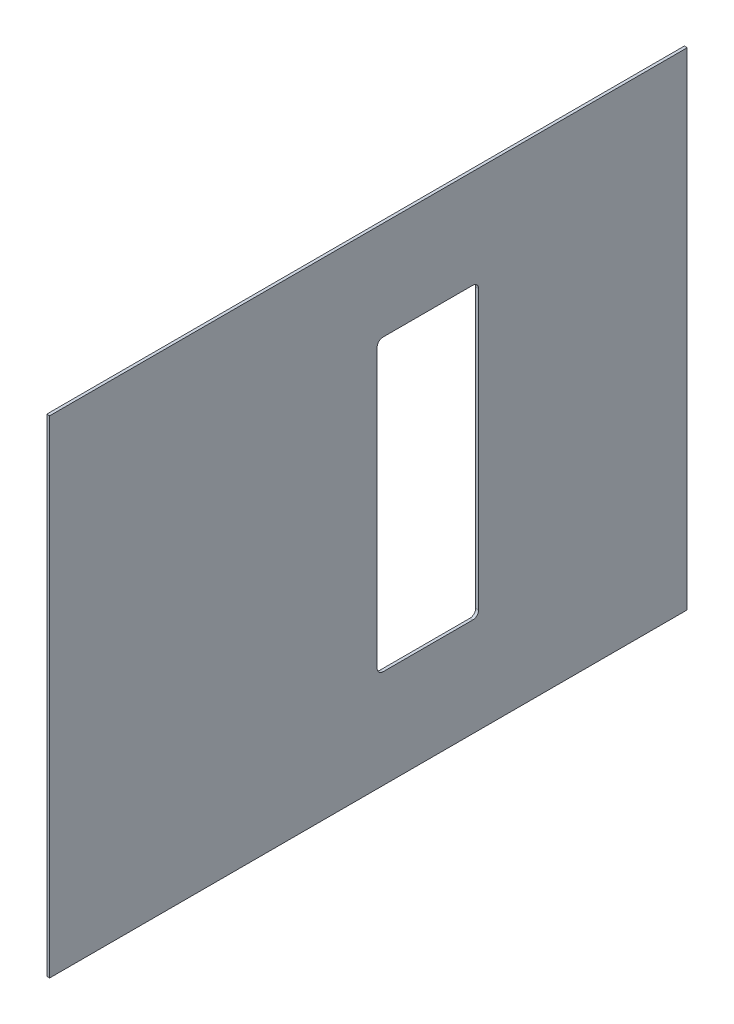
ISO-10303-21;
HEADER;
FILE_DESCRIPTION(('STEP AP214'),'2;1');
FILE_NAME('part.step','',(''),(''),'','','');
FILE_SCHEMA(('AUTOMOTIVE_DESIGN { 1 0 10303 214 1 1 1 1 }'));
ENDSEC;
DATA;
#1=APPLICATION_CONTEXT('core data for automotive mechanical design processes');
#2=APPLICATION_PROTOCOL_DEFINITION('international standard','automotive_design',2000,#1);
#3=PRODUCT_CONTEXT('',#1,'mechanical');
#4=PRODUCT('Part','Part','',(#3));
#5=PRODUCT_RELATED_PRODUCT_CATEGORY('part','',(#4));
#6=PRODUCT_DEFINITION_FORMATION('','',#4);
#7=PRODUCT_DEFINITION_CONTEXT('part definition',#1,'design');
#8=PRODUCT_DEFINITION('design','',#6,#7);
#9=PRODUCT_DEFINITION_SHAPE('','',#8);
#10=(LENGTH_UNIT() NAMED_UNIT(*) SI_UNIT(.MILLI.,.METRE.));
#11=(NAMED_UNIT(*) PLANE_ANGLE_UNIT() SI_UNIT($,.RADIAN.));
#12=(NAMED_UNIT(*) SI_UNIT($,.STERADIAN.) SOLID_ANGLE_UNIT());
#13=UNCERTAINTY_MEASURE_WITH_UNIT(LENGTH_MEASURE(1.E-05),#10,'distance_accuracy_value','');
#14=(GEOMETRIC_REPRESENTATION_CONTEXT(3) GLOBAL_UNCERTAINTY_ASSIGNED_CONTEXT((#13)) GLOBAL_UNIT_ASSIGNED_CONTEXT((#10,
#11,#12)) REPRESENTATION_CONTEXT('',''));
#15=CARTESIAN_POINT('',(0.,0.,0.));
#16=DIRECTION('',(0.,0.,1.));
#17=DIRECTION('',(1.,0.,0.));
#18=AXIS2_PLACEMENT_3D('',#15,#16,#17);
#19=CARTESIAN_POINT('',(-537.21,0.,698.5));
#20=DIRECTION('',(-1.,0.,0.));
#21=DIRECTION('',(0.,0.,1.));
#22=AXIS2_PLACEMENT_3D('',#19,#20,#21);
#23=PLANE('',#22);
#24=DIRECTION('',(0.,0.,1.));
#25=VECTOR('',#24,1.);
#26=CARTESIAN_POINT('',(-537.21,317.5,575.922617626172));
#27=LINE('',#26,#25);
#28=CARTESIAN_POINT('',(-537.21,317.5,666.75));
#29=VERTEX_POINT('',#28);
#30=CARTESIAN_POINT('',(-537.21,317.5,469.9));
#31=VERTEX_POINT('',#30);
#32=EDGE_CURVE('E125',#29,#31,#27,.F.);
#33=ORIENTED_EDGE('',*,*,#32,.T.);
#34=CARTESIAN_POINT('',(-537.21,304.8,469.9));
#35=DIRECTION('',(-1.,0.,0.));
#36=DIRECTION('',(0.,0.,1.));
#37=AXIS2_PLACEMENT_3D('',#34,#35,#36);
#38=CIRCLE('',#37,12.7);
#39=CARTESIAN_POINT('',(-537.21,304.8,457.2));
#40=VERTEX_POINT('',#39);
#41=EDGE_CURVE('E157',#31,#40,#38,.T.);
#42=ORIENTED_EDGE('',*,*,#41,.T.);
#43=DIRECTION('',(0.,1.,0.));
#44=VECTOR('',#43,1.);
#45=CARTESIAN_POINT('',(-537.21,-1.66743516922002,457.2));
#46=LINE('',#45,#44);
#47=CARTESIAN_POINT('',(-537.21,-304.8,457.2));
#48=VERTEX_POINT('',#47);
#49=EDGE_CURVE('E130',#48,#40,#46,.T.);
#50=ORIENTED_EDGE('',*,*,#49,.F.);
#51=CARTESIAN_POINT('',(-537.21,-304.8,469.9));
#52=DIRECTION('',(-1.,0.,0.));
#53=DIRECTION('',(0.,0.,1.));
#54=AXIS2_PLACEMENT_3D('',#51,#52,#53);
#55=CIRCLE('',#54,12.7);
#56=CARTESIAN_POINT('',(-537.21,-317.5,469.9));
#57=VERTEX_POINT('',#56);
#58=EDGE_CURVE('E133',#48,#57,#55,.T.);
#59=ORIENTED_EDGE('',*,*,#58,.T.);
#60=DIRECTION('',(0.,0.,1.));
#61=VECTOR('',#60,1.);
#62=CARTESIAN_POINT('',(-537.21,-317.5,575.922617626172));
#63=LINE('',#62,#61);
#64=CARTESIAN_POINT('',(-537.21,-317.5,666.75));
#65=VERTEX_POINT('',#64);
#66=EDGE_CURVE('E134',#65,#57,#63,.F.);
#67=ORIENTED_EDGE('',*,*,#66,.F.);
#68=CARTESIAN_POINT('',(-537.21,-304.8,666.75));
#69=DIRECTION('',(-1.,0.,0.));
#70=DIRECTION('',(0.,0.,1.));
#71=AXIS2_PLACEMENT_3D('',#68,#69,#70);
#72=CIRCLE('',#71,12.7);
#73=CARTESIAN_POINT('',(-537.21,-304.8,679.45));
#74=VERTEX_POINT('',#73);
#75=EDGE_CURVE('E137',#65,#74,#72,.T.);
#76=ORIENTED_EDGE('',*,*,#75,.T.);
#77=DIRECTION('',(0.,1.,0.));
#78=VECTOR('',#77,1.);
#79=CARTESIAN_POINT('',(-537.21,-1.66743516922002,679.45));
#80=LINE('',#79,#78);
#81=CARTESIAN_POINT('',(-537.21,304.8,679.45));
#82=VERTEX_POINT('',#81);
#83=EDGE_CURVE('E138',#74,#82,#80,.T.);
#84=ORIENTED_EDGE('',*,*,#83,.T.);
#85=CARTESIAN_POINT('',(-537.21,304.8,666.75));
#86=DIRECTION('',(-1.,0.,0.));
#87=DIRECTION('',(0.,0.,1.));
#88=AXIS2_PLACEMENT_3D('',#85,#86,#87);
#89=CIRCLE('',#88,12.7);
#90=EDGE_CURVE('E19',#82,#29,#89,.T.);
#91=ORIENTED_EDGE('',*,*,#90,.T.);
#92=EDGE_LOOP('',(#33,#42,#50,#59,#67,#76,#84,#91));
#93=FACE_BOUND('',#92,.T.);
#94=DIRECTION('',(0.,1.,0.));
#95=VECTOR('',#94,1.);
#96=CARTESIAN_POINT('',(-537.21,-61.4601382255534,1397.));
#97=LINE('',#96,#95);
#98=CARTESIAN_POINT('',(-537.21,-533.4,1397.));
#99=VERTEX_POINT('',#98);
#100=CARTESIAN_POINT('',(-537.21,533.4,1397.));
#101=VERTEX_POINT('',#100);
#102=EDGE_CURVE('E179',#99,#101,#97,.T.);
#103=ORIENTED_EDGE('',*,*,#102,.F.);
#104=DIRECTION('',(0.,0.,1.));
#105=VECTOR('',#104,1.);
#106=CARTESIAN_POINT('',(-537.21,-533.4,417.48526692391));
#107=LINE('',#106,#105);
#108=CARTESIAN_POINT('',(-537.21,-533.4,0.));
#109=VERTEX_POINT('',#108);
#110=EDGE_CURVE('E112',#99,#109,#107,.F.);
#111=ORIENTED_EDGE('',*,*,#110,.T.);
#112=DIRECTION('',(0.,1.,0.));
#113=VECTOR('',#112,1.);
#114=CARTESIAN_POINT('',(-537.21,20.8030939102161,0.));
#115=LINE('',#114,#113);
#116=CARTESIAN_POINT('',(-537.21,533.4,0.));
#117=VERTEX_POINT('',#116);
#118=EDGE_CURVE('E110',#109,#117,#115,.T.);
#119=ORIENTED_EDGE('',*,*,#118,.T.);
#120=DIRECTION('',(0.,0.,1.));
#121=VECTOR('',#120,1.);
#122=CARTESIAN_POINT('',(-537.21,533.4,417.48526692391));
#123=LINE('',#122,#121);
#124=EDGE_CURVE('E89',#101,#117,#123,.F.);
#125=ORIENTED_EDGE('',*,*,#124,.F.);
#126=EDGE_LOOP('',(#103,#111,#119,#125));
#127=FACE_BOUND('',#126,.T.);
#128=ADVANCED_FACE('F16',(#93,#127),#23,.F.);
#129=CARTESIAN_POINT('',(-543.56,533.4,417.48526692391));
#130=DIRECTION('',(0.,1.,0.));
#131=DIRECTION('',(0.,0.,1.));
#132=AXIS2_PLACEMENT_3D('',#129,#130,#131);
#133=PLANE('',#132);
#134=DIRECTION('',(0.,0.,1.));
#135=VECTOR('',#134,1.);
#136=CARTESIAN_POINT('',(-543.56,533.4,698.5));
#137=LINE('',#136,#135);
#138=CARTESIAN_POINT('',(-543.56,533.4,1397.));
#139=VERTEX_POINT('',#138);
#140=CARTESIAN_POINT('',(-543.56,533.4,0.));
#141=VERTEX_POINT('',#140);
#142=EDGE_CURVE('E128',#139,#141,#137,.F.);
#143=ORIENTED_EDGE('',*,*,#142,.F.);
#144=DIRECTION('',(1.,0.,0.));
#145=VECTOR('',#144,1.);
#146=CARTESIAN_POINT('',(-543.56,533.4,1397.));
#147=LINE('',#146,#145);
#148=EDGE_CURVE('E106',#101,#139,#147,.F.);
#149=ORIENTED_EDGE('',*,*,#148,.F.);
#150=ORIENTED_EDGE('',*,*,#124,.T.);
#151=DIRECTION('',(1.,0.,0.));
#152=VECTOR('',#151,1.);
#153=CARTESIAN_POINT('',(-543.56,533.4,0.));
#154=LINE('',#153,#152);
#155=EDGE_CURVE('E103',#117,#141,#154,.F.);
#156=ORIENTED_EDGE('',*,*,#155,.T.);
#157=EDGE_LOOP('',(#143,#149,#150,#156));
#158=FACE_BOUND('',#157,.T.);
#159=ADVANCED_FACE('F100',(#158),#133,.T.);
#160=CARTESIAN_POINT('',(-543.56,20.8030939102161,0.));
#161=DIRECTION('',(0.,0.,1.));
#162=DIRECTION('',(1.,0.,0.));
#163=AXIS2_PLACEMENT_3D('',#160,#161,#162);
#164=PLANE('',#163);
#165=DIRECTION('',(1.,0.,0.));
#166=VECTOR('',#165,1.);
#167=CARTESIAN_POINT('',(-543.56,-533.4,0.));
#168=LINE('',#167,#166);
#169=CARTESIAN_POINT('',(-543.56,-533.4,0.));
#170=VERTEX_POINT('',#169);
#171=EDGE_CURVE('E116',#109,#170,#168,.F.);
#172=ORIENTED_EDGE('',*,*,#171,.T.);
#173=DIRECTION('',(0.,1.,0.));
#174=VECTOR('',#173,1.);
#175=CARTESIAN_POINT('',(-543.56,0.,0.));
#176=LINE('',#175,#174);
#177=EDGE_CURVE('E120',#141,#170,#176,.F.);
#178=ORIENTED_EDGE('',*,*,#177,.F.);
#179=ORIENTED_EDGE('',*,*,#155,.F.);
#180=ORIENTED_EDGE('',*,*,#118,.F.);
#181=EDGE_LOOP('',(#172,#178,#179,#180));
#182=FACE_BOUND('',#181,.T.);
#183=ADVANCED_FACE('F118',(#182),#164,.F.);
#184=CARTESIAN_POINT('',(-543.56,-533.4,417.48526692391));
#185=DIRECTION('',(0.,1.,0.));
#186=DIRECTION('',(0.,0.,1.));
#187=AXIS2_PLACEMENT_3D('',#184,#185,#186);
#188=PLANE('',#187);
#189=DIRECTION('',(1.,0.,0.));
#190=VECTOR('',#189,1.);
#191=CARTESIAN_POINT('',(-543.56,-533.4,1397.));
#192=LINE('',#191,#190);
#193=CARTESIAN_POINT('',(-543.56,-533.4,1397.));
#194=VERTEX_POINT('',#193);
#195=EDGE_CURVE('E175',#194,#99,#192,.T.);
#196=ORIENTED_EDGE('',*,*,#195,.F.);
#197=DIRECTION('',(0.,0.,1.));
#198=VECTOR('',#197,1.);
#199=CARTESIAN_POINT('',(-543.56,-533.4,698.5));
#200=LINE('',#199,#198);
#201=EDGE_CURVE('E187',#170,#194,#200,.T.);
#202=ORIENTED_EDGE('',*,*,#201,.F.);
#203=ORIENTED_EDGE('',*,*,#171,.F.);
#204=ORIENTED_EDGE('',*,*,#110,.F.);
#205=EDGE_LOOP('',(#196,#202,#203,#204));
#206=FACE_BOUND('',#205,.T.);
#207=ADVANCED_FACE('F188',(#206),#188,.F.);
#208=CARTESIAN_POINT('',(-543.56,-61.4601382255534,1397.));
#209=DIRECTION('',(0.,0.,1.));
#210=DIRECTION('',(1.,0.,0.));
#211=AXIS2_PLACEMENT_3D('',#208,#209,#210);
#212=PLANE('',#211);
#213=DIRECTION('',(0.,1.,0.));
#214=VECTOR('',#213,1.);
#215=CARTESIAN_POINT('',(-543.56,0.,1397.));
#216=LINE('',#215,#214);
#217=EDGE_CURVE('E156',#194,#139,#216,.T.);
#218=ORIENTED_EDGE('',*,*,#217,.F.);
#219=ORIENTED_EDGE('',*,*,#195,.T.);
#220=ORIENTED_EDGE('',*,*,#102,.T.);
#221=ORIENTED_EDGE('',*,*,#148,.T.);
#222=EDGE_LOOP('',(#218,#219,#220,#221));
#223=FACE_BOUND('',#222,.T.);
#224=ADVANCED_FACE('F220',(#223),#212,.T.);
#225=CARTESIAN_POINT('',(-543.56,304.8,666.75));
#226=DIRECTION('',(-1.,0.,0.));
#227=DIRECTION('',(0.,0.,1.));
#228=AXIS2_PLACEMENT_3D('',#225,#226,#227);
#229=CYLINDRICAL_SURFACE('',#228,12.7);
#230=DIRECTION('',(1.,0.,0.));
#231=VECTOR('',#230,1.);
#232=CARTESIAN_POINT('',(-543.56,304.8,679.45));
#233=LINE('',#232,#231);
#234=CARTESIAN_POINT('',(-543.56,304.8,679.45));
#235=VERTEX_POINT('',#234);
#236=EDGE_CURVE('E141',#82,#235,#233,.F.);
#237=ORIENTED_EDGE('',*,*,#236,.T.);
#238=CARTESIAN_POINT('',(-543.56,304.8,666.75));
#239=DIRECTION('',(-1.,0.,0.));
#240=DIRECTION('',(0.,0.,1.));
#241=AXIS2_PLACEMENT_3D('',#238,#239,#240);
#242=CIRCLE('',#241,12.7);
#243=CARTESIAN_POINT('',(-543.56,317.5,666.75));
#244=VERTEX_POINT('',#243);
#245=EDGE_CURVE('E153',#244,#235,#242,.F.);
#246=ORIENTED_EDGE('',*,*,#245,.F.);
#247=DIRECTION('',(1.,0.,0.));
#248=VECTOR('',#247,1.);
#249=CARTESIAN_POINT('',(-543.56,317.5,666.75));
#250=LINE('',#249,#248);
#251=EDGE_CURVE('E129',#244,#29,#250,.T.);
#252=ORIENTED_EDGE('',*,*,#251,.T.);
#253=ORIENTED_EDGE('',*,*,#90,.F.);
#254=EDGE_LOOP('',(#237,#246,#252,#253));
#255=FACE_BOUND('',#254,.T.);
#256=ADVANCED_FACE('F223',(#255),#229,.F.);
#257=CARTESIAN_POINT('',(-543.56,-1.66743516922002,679.45));
#258=DIRECTION('',(0.,0.,1.));
#259=DIRECTION('',(1.,0.,0.));
#260=AXIS2_PLACEMENT_3D('',#257,#258,#259);
#261=PLANE('',#260);
#262=DIRECTION('',(-1.,0.,0.));
#263=VECTOR('',#262,1.);
#264=CARTESIAN_POINT('',(-543.56,-304.8,679.45));
#265=LINE('',#264,#263);
#266=CARTESIAN_POINT('',(-543.56,-304.8,679.45));
#267=VERTEX_POINT('',#266);
#268=EDGE_CURVE('E140',#74,#267,#265,.T.);
#269=ORIENTED_EDGE('',*,*,#268,.T.);
#270=DIRECTION('',(0.,1.,0.));
#271=VECTOR('',#270,1.);
#272=CARTESIAN_POINT('',(-543.56,0.,679.45));
#273=LINE('',#272,#271);
#274=EDGE_CURVE('E152',#235,#267,#273,.F.);
#275=ORIENTED_EDGE('',*,*,#274,.F.);
#276=ORIENTED_EDGE('',*,*,#236,.F.);
#277=ORIENTED_EDGE('',*,*,#83,.F.);
#278=EDGE_LOOP('',(#269,#275,#276,#277));
#279=FACE_BOUND('',#278,.T.);
#280=ADVANCED_FACE('F230',(#279),#261,.F.);
#281=CARTESIAN_POINT('',(-543.56,-304.8,666.75));
#282=DIRECTION('',(-1.,0.,0.));
#283=DIRECTION('',(0.,0.,1.));
#284=AXIS2_PLACEMENT_3D('',#281,#282,#283);
#285=CYLINDRICAL_SURFACE('',#284,12.7);
#286=DIRECTION('',(1.,0.,0.));
#287=VECTOR('',#286,1.);
#288=CARTESIAN_POINT('',(-543.56,-317.5,666.75));
#289=LINE('',#288,#287);
#290=CARTESIAN_POINT('',(-543.56,-317.5,666.75));
#291=VERTEX_POINT('',#290);
#292=EDGE_CURVE('E136',#291,#65,#289,.T.);
#293=ORIENTED_EDGE('',*,*,#292,.F.);
#294=CARTESIAN_POINT('',(-543.56,-304.8,666.75));
#295=DIRECTION('',(-1.,0.,0.));
#296=DIRECTION('',(0.,0.,1.));
#297=AXIS2_PLACEMENT_3D('',#294,#295,#296);
#298=CIRCLE('',#297,12.7);
#299=EDGE_CURVE('E149',#267,#291,#298,.F.);
#300=ORIENTED_EDGE('',*,*,#299,.F.);
#301=ORIENTED_EDGE('',*,*,#268,.F.);
#302=ORIENTED_EDGE('',*,*,#75,.F.);
#303=EDGE_LOOP('',(#293,#300,#301,#302));
#304=FACE_BOUND('',#303,.T.);
#305=ADVANCED_FACE('F210',(#304),#285,.F.);
#306=CARTESIAN_POINT('',(-543.56,-317.5,575.922617626172));
#307=DIRECTION('',(0.,1.,0.));
#308=DIRECTION('',(0.,0.,1.));
#309=AXIS2_PLACEMENT_3D('',#306,#307,#308);
#310=PLANE('',#309);
#311=DIRECTION('',(0.,0.,1.));
#312=VECTOR('',#311,1.);
#313=CARTESIAN_POINT('',(-543.56,-317.5,698.5));
#314=LINE('',#313,#312);
#315=CARTESIAN_POINT('',(-543.56,-317.5,469.9));
#316=VERTEX_POINT('',#315);
#317=EDGE_CURVE('E148',#291,#316,#314,.F.);
#318=ORIENTED_EDGE('',*,*,#317,.F.);
#319=ORIENTED_EDGE('',*,*,#292,.T.);
#320=ORIENTED_EDGE('',*,*,#66,.T.);
#321=DIRECTION('',(-1.,0.,0.));
#322=VECTOR('',#321,1.);
#323=CARTESIAN_POINT('',(-543.56,-317.5,469.9));
#324=LINE('',#323,#322);
#325=EDGE_CURVE('E162',#57,#316,#324,.T.);
#326=ORIENTED_EDGE('',*,*,#325,.T.);
#327=EDGE_LOOP('',(#318,#319,#320,#326));
#328=FACE_BOUND('',#327,.T.);
#329=ADVANCED_FACE('F207',(#328),#310,.T.);
#330=CARTESIAN_POINT('',(-543.56,-304.8,469.9));
#331=DIRECTION('',(-1.,0.,0.));
#332=DIRECTION('',(0.,0.,1.));
#333=AXIS2_PLACEMENT_3D('',#330,#331,#332);
#334=CYLINDRICAL_SURFACE('',#333,12.7);
#335=DIRECTION('',(1.,0.,0.));
#336=VECTOR('',#335,1.);
#337=CARTESIAN_POINT('',(-543.56,-304.8,457.2));
#338=LINE('',#337,#336);
#339=CARTESIAN_POINT('',(-543.56,-304.8,457.2));
#340=VERTEX_POINT('',#339);
#341=EDGE_CURVE('E132',#340,#48,#338,.T.);
#342=ORIENTED_EDGE('',*,*,#341,.F.);
#343=CARTESIAN_POINT('',(-543.56,-304.8,469.9));
#344=DIRECTION('',(-1.,0.,0.));
#345=DIRECTION('',(0.,0.,1.));
#346=AXIS2_PLACEMENT_3D('',#343,#344,#345);
#347=CIRCLE('',#346,12.7);
#348=EDGE_CURVE('E145',#316,#340,#347,.F.);
#349=ORIENTED_EDGE('',*,*,#348,.F.);
#350=ORIENTED_EDGE('',*,*,#325,.F.);
#351=ORIENTED_EDGE('',*,*,#58,.F.);
#352=EDGE_LOOP('',(#342,#349,#350,#351));
#353=FACE_BOUND('',#352,.T.);
#354=ADVANCED_FACE('F248',(#353),#334,.F.);
#355=CARTESIAN_POINT('',(-543.56,-1.66743516922002,457.2));
#356=DIRECTION('',(0.,0.,1.));
#357=DIRECTION('',(1.,0.,0.));
#358=AXIS2_PLACEMENT_3D('',#355,#356,#357);
#359=PLANE('',#358);
#360=DIRECTION('',(0.,1.,0.));
#361=VECTOR('',#360,1.);
#362=CARTESIAN_POINT('',(-543.56,0.,457.2));
#363=LINE('',#362,#361);
#364=CARTESIAN_POINT('',(-543.56,304.8,457.2));
#365=VERTEX_POINT('',#364);
#366=EDGE_CURVE('E144',#340,#365,#363,.T.);
#367=ORIENTED_EDGE('',*,*,#366,.F.);
#368=ORIENTED_EDGE('',*,*,#341,.T.);
#369=ORIENTED_EDGE('',*,*,#49,.T.);
#370=DIRECTION('',(-1.,0.,0.));
#371=VECTOR('',#370,1.);
#372=CARTESIAN_POINT('',(-543.56,304.8,457.2));
#373=LINE('',#372,#371);
#374=EDGE_CURVE('E160',#40,#365,#373,.T.);
#375=ORIENTED_EDGE('',*,*,#374,.T.);
#376=EDGE_LOOP('',(#367,#368,#369,#375));
#377=FACE_BOUND('',#376,.T.);
#378=ADVANCED_FACE('F245',(#377),#359,.T.);
#379=CARTESIAN_POINT('',(-543.56,304.8,469.9));
#380=DIRECTION('',(-1.,0.,0.));
#381=DIRECTION('',(0.,0.,1.));
#382=AXIS2_PLACEMENT_3D('',#379,#380,#381);
#383=CYLINDRICAL_SURFACE('',#382,12.7);
#384=DIRECTION('',(1.,0.,0.));
#385=VECTOR('',#384,1.);
#386=CARTESIAN_POINT('',(-543.56,317.5,469.9));
#387=LINE('',#386,#385);
#388=CARTESIAN_POINT('',(-543.56,317.5,469.9));
#389=VERTEX_POINT('',#388);
#390=EDGE_CURVE('E34',#31,#389,#387,.F.);
#391=ORIENTED_EDGE('',*,*,#390,.T.);
#392=CARTESIAN_POINT('',(-543.56,304.8,469.9));
#393=DIRECTION('',(-1.,0.,0.));
#394=DIRECTION('',(0.,0.,1.));
#395=AXIS2_PLACEMENT_3D('',#392,#393,#394);
#396=CIRCLE('',#395,12.7);
#397=EDGE_CURVE('E25',#365,#389,#396,.F.);
#398=ORIENTED_EDGE('',*,*,#397,.F.);
#399=ORIENTED_EDGE('',*,*,#374,.F.);
#400=ORIENTED_EDGE('',*,*,#41,.F.);
#401=EDGE_LOOP('',(#391,#398,#399,#400));
#402=FACE_BOUND('',#401,.T.);
#403=ADVANCED_FACE('F239',(#402),#383,.F.);
#404=CARTESIAN_POINT('',(-543.56,317.5,575.922617626172));
#405=DIRECTION('',(0.,1.,0.));
#406=DIRECTION('',(0.,0.,1.));
#407=AXIS2_PLACEMENT_3D('',#404,#405,#406);
#408=PLANE('',#407);
#409=ORIENTED_EDGE('',*,*,#251,.F.);
#410=DIRECTION('',(0.,0.,1.));
#411=VECTOR('',#410,1.);
#412=CARTESIAN_POINT('',(-543.56,317.5,698.5));
#413=LINE('',#412,#411);
#414=EDGE_CURVE('E11',#389,#244,#413,.T.);
#415=ORIENTED_EDGE('',*,*,#414,.F.);
#416=ORIENTED_EDGE('',*,*,#390,.F.);
#417=ORIENTED_EDGE('',*,*,#32,.F.);
#418=EDGE_LOOP('',(#409,#415,#416,#417));
#419=FACE_BOUND('',#418,.T.);
#420=ADVANCED_FACE('F234',(#419),#408,.F.);
#421=CARTESIAN_POINT('',(-543.56,0.,698.5));
#422=DIRECTION('',(-1.,0.,0.));
#423=DIRECTION('',(0.,0.,1.));
#424=AXIS2_PLACEMENT_3D('',#421,#422,#423);
#425=PLANE('',#424);
#426=ORIENTED_EDGE('',*,*,#397,.T.);
#427=ORIENTED_EDGE('',*,*,#414,.T.);
#428=ORIENTED_EDGE('',*,*,#245,.T.);
#429=ORIENTED_EDGE('',*,*,#274,.T.);
#430=ORIENTED_EDGE('',*,*,#299,.T.);
#431=ORIENTED_EDGE('',*,*,#317,.T.);
#432=ORIENTED_EDGE('',*,*,#348,.T.);
#433=ORIENTED_EDGE('',*,*,#366,.T.);
#434=EDGE_LOOP('',(#426,#427,#428,#429,#430,#431,#432,#433));
#435=FACE_BOUND('',#434,.T.);
#436=ORIENTED_EDGE('',*,*,#201,.T.);
#437=ORIENTED_EDGE('',*,*,#217,.T.);
#438=ORIENTED_EDGE('',*,*,#142,.T.);
#439=ORIENTED_EDGE('',*,*,#177,.T.);
#440=EDGE_LOOP('',(#436,#437,#438,#439));
#441=FACE_BOUND('',#440,.T.);
#442=ADVANCED_FACE('F193',(#435,#441),#425,.T.);
#443=CLOSED_SHELL('',(#128,#159,#183,#207,#224,#256,#280,#305,#329,#354,#378,#403,#420,#442));
#444=MANIFOLD_SOLID_BREP('B1',#443);
#445=ADVANCED_BREP_SHAPE_REPRESENTATION('',(#18,#444),#14);
#446=SHAPE_DEFINITION_REPRESENTATION(#9,#445);
ENDSEC;
END-ISO-10303-21;
